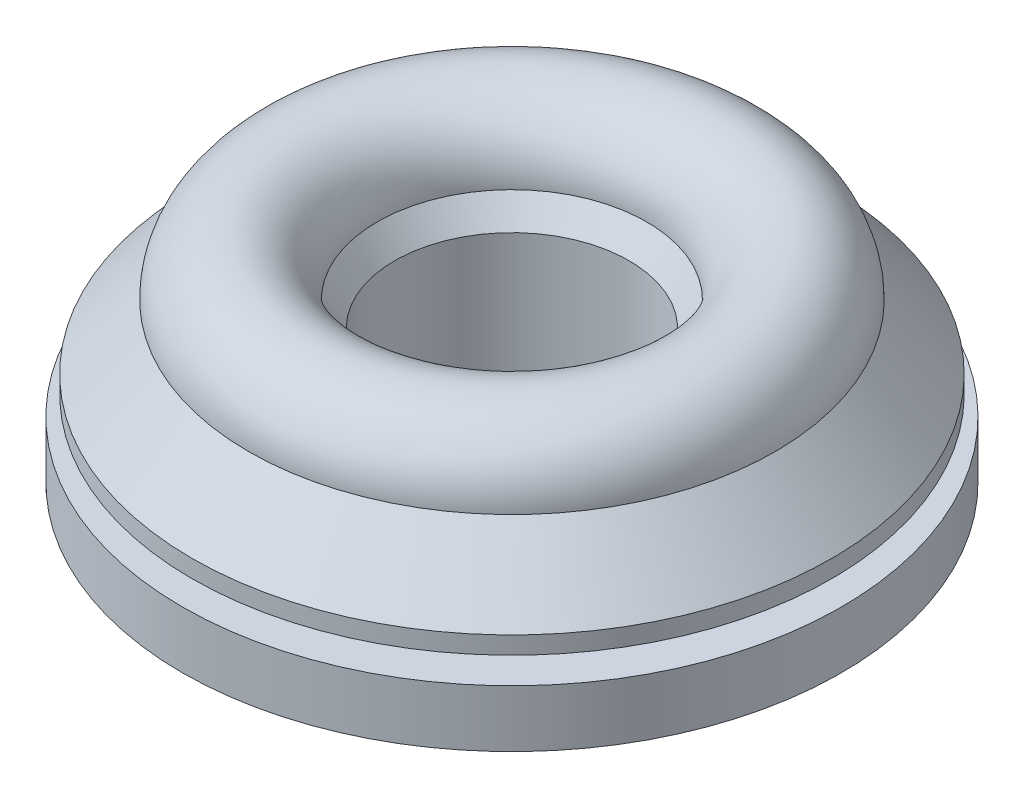
ISO-10303-21;
HEADER;
FILE_DESCRIPTION(('STEP AP214'),'2;1');
FILE_NAME('part.step','',(''),(''),'','','');
FILE_SCHEMA(('AUTOMOTIVE_DESIGN { 1 0 10303 214 1 1 1 1 }'));
ENDSEC;
DATA;
#1=APPLICATION_CONTEXT('core data for automotive mechanical design processes');
#2=APPLICATION_PROTOCOL_DEFINITION('international standard','automotive_design',2000,#1);
#3=PRODUCT_CONTEXT('',#1,'mechanical');
#4=PRODUCT('Part','Part','',(#3));
#5=PRODUCT_RELATED_PRODUCT_CATEGORY('part','',(#4));
#6=PRODUCT_DEFINITION_FORMATION('','',#4);
#7=PRODUCT_DEFINITION_CONTEXT('part definition',#1,'design');
#8=PRODUCT_DEFINITION('design','',#6,#7);
#9=PRODUCT_DEFINITION_SHAPE('','',#8);
#10=(LENGTH_UNIT() NAMED_UNIT(*) SI_UNIT(.MILLI.,.METRE.));
#11=(NAMED_UNIT(*) PLANE_ANGLE_UNIT() SI_UNIT($,.RADIAN.));
#12=(NAMED_UNIT(*) SI_UNIT($,.STERADIAN.) SOLID_ANGLE_UNIT());
#13=UNCERTAINTY_MEASURE_WITH_UNIT(LENGTH_MEASURE(1.E-05),#10,'distance_accuracy_value','');
#14=(GEOMETRIC_REPRESENTATION_CONTEXT(3) GLOBAL_UNCERTAINTY_ASSIGNED_CONTEXT((#13)) GLOBAL_UNIT_ASSIGNED_CONTEXT((#10,
#11,#12)) REPRESENTATION_CONTEXT('',''));
#15=CARTESIAN_POINT('',(0.,0.,0.));
#16=DIRECTION('',(0.,0.,1.));
#17=DIRECTION('',(1.,0.,0.));
#18=AXIS2_PLACEMENT_3D('',#15,#16,#17);
#19=CARTESIAN_POINT('',(0.,10.1346,0.));
#20=DIRECTION('',(0.,1.,0.));
#21=DIRECTION('',(0.,0.,1.));
#22=AXIS2_PLACEMENT_3D('',#19,#20,#21);
#23=CYLINDRICAL_SURFACE('',#22,21.43125);
#24=CARTESIAN_POINT('',(0.,-0.635,0.));
#25=DIRECTION('',(0.,1.,0.));
#26=DIRECTION('',(0.,0.,1.));
#27=AXIS2_PLACEMENT_3D('',#24,#25,#26);
#28=CIRCLE('',#27,21.43125);
#29=CARTESIAN_POINT('',(0.,-0.635,21.43125));
#30=VERTEX_POINT('',#29);
#31=EDGE_CURVE('E10',#30,#30,#28,.T.);
#32=ORIENTED_EDGE('',*,*,#31,.F.);
#33=EDGE_LOOP('',(#32));
#34=FACE_BOUND('',#33,.T.);
#35=CARTESIAN_POINT('',(0.,-4.3434,0.));
#36=DIRECTION('',(0.,1.,0.));
#37=DIRECTION('',(0.,0.,1.));
#38=AXIS2_PLACEMENT_3D('',#35,#36,#37);
#39=CIRCLE('',#38,21.43125);
#40=CARTESIAN_POINT('',(0.,-4.3434,21.43125));
#41=VERTEX_POINT('',#40);
#42=EDGE_CURVE('E86',#41,#41,#39,.T.);
#43=ORIENTED_EDGE('',*,*,#42,.T.);
#44=EDGE_LOOP('',(#43));
#45=FACE_BOUND('',#44,.T.);
#46=ADVANCED_FACE('F40',(#34,#45),#23,.T.);
#47=CARTESIAN_POINT('',(21.43125,-0.635,0.));
#48=DIRECTION('',(0.,-1.,0.));
#49=DIRECTION('',(0.,0.,-1.));
#50=AXIS2_PLACEMENT_3D('',#47,#48,#49);
#51=PLANE('',#50);
#52=CARTESIAN_POINT('',(0.,-0.635,0.));
#53=DIRECTION('',(0.,1.,0.));
#54=DIRECTION('',(0.,0.,1.));
#55=AXIS2_PLACEMENT_3D('',#52,#53,#54);
#56=CIRCLE('',#55,17.4625);
#57=CARTESIAN_POINT('',(0.,-0.635,17.4625));
#58=VERTEX_POINT('',#57);
#59=EDGE_CURVE('E47',#58,#58,#56,.T.);
#60=ORIENTED_EDGE('',*,*,#59,.F.);
#61=EDGE_LOOP('',(#60));
#62=FACE_BOUND('',#61,.T.);
#63=ORIENTED_EDGE('',*,*,#31,.T.);
#64=EDGE_LOOP('',(#63));
#65=FACE_BOUND('',#64,.T.);
#66=ADVANCED_FACE('F136',(#62,#65),#51,.F.);
#67=CARTESIAN_POINT('',(0.,10.1346,0.));
#68=DIRECTION('',(0.,1.,0.));
#69=DIRECTION('',(0.,0.,1.));
#70=AXIS2_PLACEMENT_3D('',#67,#68,#69);
#71=CYLINDRICAL_SURFACE('',#70,17.4625);
#72=CARTESIAN_POINT('',(0.,0.635,0.));
#73=DIRECTION('',(0.,1.,0.));
#74=DIRECTION('',(0.,0.,1.));
#75=AXIS2_PLACEMENT_3D('',#72,#73,#74);
#76=CIRCLE('',#75,17.4625);
#77=CARTESIAN_POINT('',(0.,0.635,17.4625));
#78=VERTEX_POINT('',#77);
#79=EDGE_CURVE('E55',#78,#78,#76,.T.);
#80=ORIENTED_EDGE('',*,*,#79,.F.);
#81=EDGE_LOOP('',(#80));
#82=FACE_BOUND('',#81,.T.);
#83=ORIENTED_EDGE('',*,*,#59,.T.);
#84=EDGE_LOOP('',(#83));
#85=FACE_BOUND('',#84,.T.);
#86=ADVANCED_FACE('F131',(#82,#85),#71,.T.);
#87=CARTESIAN_POINT('',(17.4625,0.635,0.));
#88=DIRECTION('',(0.,1.,0.));
#89=DIRECTION('',(0.,0.,1.));
#90=AXIS2_PLACEMENT_3D('',#87,#88,#89);
#91=PLANE('',#90);
#92=CARTESIAN_POINT('',(0.,0.635,0.));
#93=DIRECTION('',(0.,1.,0.));
#94=DIRECTION('',(0.,0.,1.));
#95=AXIS2_PLACEMENT_3D('',#92,#93,#94);
#96=CIRCLE('',#95,20.79625);
#97=CARTESIAN_POINT('',(0.,0.635,20.79625));
#98=VERTEX_POINT('',#97);
#99=EDGE_CURVE('E62',#98,#98,#96,.T.);
#100=ORIENTED_EDGE('',*,*,#99,.F.);
#101=EDGE_LOOP('',(#100));
#102=FACE_BOUND('',#101,.T.);
#103=ORIENTED_EDGE('',*,*,#79,.T.);
#104=EDGE_LOOP('',(#103));
#105=FACE_BOUND('',#104,.T.);
#106=ADVANCED_FACE('F125',(#102,#105),#91,.F.);
#107=CARTESIAN_POINT('',(0.,10.1346,0.));
#108=DIRECTION('',(0.,1.,0.));
#109=DIRECTION('',(0.,0.,1.));
#110=AXIS2_PLACEMENT_3D('',#107,#108,#109);
#111=CYLINDRICAL_SURFACE('',#110,20.79625);
#112=CARTESIAN_POINT('',(0.,1.778,0.));
#113=DIRECTION('',(0.,1.,0.));
#114=DIRECTION('',(0.,0.,1.));
#115=AXIS2_PLACEMENT_3D('',#112,#113,#114);
#116=CIRCLE('',#115,20.79625);
#117=CARTESIAN_POINT('',(0.,1.778,20.79625));
#118=VERTEX_POINT('',#117);
#119=EDGE_CURVE('E67',#118,#118,#116,.T.);
#120=ORIENTED_EDGE('',*,*,#119,.F.);
#121=EDGE_LOOP('',(#120));
#122=FACE_BOUND('',#121,.T.);
#123=ORIENTED_EDGE('',*,*,#99,.T.);
#124=EDGE_LOOP('',(#123));
#125=FACE_BOUND('',#124,.T.);
#126=ADVANCED_FACE('F119',(#122,#125),#111,.T.);
#127=CARTESIAN_POINT('',(0.,1.778,0.));
#128=DIRECTION('',(0.,-1.,0.));
#129=DIRECTION('',(0.,0.,-1.));
#130=AXIS2_PLACEMENT_3D('',#127,#128,#129);
#131=CONICAL_SURFACE('',#130,20.79625,0.721620590209713);
#132=CARTESIAN_POINT('',(0.,5.9563,0.));
#133=DIRECTION('',(0.,1.,0.));
#134=DIRECTION('',(0.,0.,1.));
#135=AXIS2_PLACEMENT_3D('',#132,#133,#134);
#136=CIRCLE('',#135,17.1196);
#137=CARTESIAN_POINT('',(0.,5.9563,17.1196));
#138=VERTEX_POINT('',#137);
#139=EDGE_CURVE('E70',#138,#138,#136,.T.);
#140=ORIENTED_EDGE('',*,*,#139,.F.);
#141=EDGE_LOOP('',(#140));
#142=FACE_BOUND('',#141,.T.);
#143=ORIENTED_EDGE('',*,*,#119,.T.);
#144=EDGE_LOOP('',(#143));
#145=FACE_BOUND('',#144,.T.);
#146=ADVANCED_FACE('F113',(#142,#145),#131,.T.);
#147=CARTESIAN_POINT('',(0.,5.9563,0.));
#148=DIRECTION('',(0.,1.,0.));
#149=DIRECTION('',(0.,0.,1.));
#150=AXIS2_PLACEMENT_3D('',#147,#148,#149);
#151=TOROIDAL_SURFACE('',#150,12.9413,4.1783);
#152=CARTESIAN_POINT('',(0.,5.9563,0.));
#153=DIRECTION('',(0.,1.,0.));
#154=DIRECTION('',(0.,0.,1.));
#155=AXIS2_PLACEMENT_3D('',#152,#153,#154);
#156=CIRCLE('',#155,8.763);
#157=CARTESIAN_POINT('',(0.,5.9563,8.763));
#158=VERTEX_POINT('',#157);
#159=EDGE_CURVE('E74',#158,#158,#156,.T.);
#160=ORIENTED_EDGE('',*,*,#159,.F.);
#161=EDGE_LOOP('',(#160));
#162=FACE_BOUND('',#161,.T.);
#163=ORIENTED_EDGE('',*,*,#139,.T.);
#164=EDGE_LOOP('',(#163));
#165=FACE_BOUND('',#164,.T.);
#166=ADVANCED_FACE('F107',(#162,#165),#151,.T.);
#167=CARTESIAN_POINT('',(0.,5.9563,0.));
#168=DIRECTION('',(0.,1.,0.));
#169=DIRECTION('',(0.,0.,1.));
#170=AXIS2_PLACEMENT_3D('',#167,#168,#169);
#171=CONICAL_SURFACE('',#170,8.763,0.61651537339085);
#172=CARTESIAN_POINT('',(0.,4.3434,0.));
#173=DIRECTION('',(0.,1.,0.));
#174=DIRECTION('',(0.,0.,1.));
#175=AXIS2_PLACEMENT_3D('',#172,#173,#174);
#176=CIRCLE('',#175,7.62);
#177=CARTESIAN_POINT('',(0.,4.3434,7.62));
#178=VERTEX_POINT('',#177);
#179=EDGE_CURVE('E78',#178,#178,#176,.T.);
#180=ORIENTED_EDGE('',*,*,#179,.F.);
#181=EDGE_LOOP('',(#180));
#182=FACE_BOUND('',#181,.T.);
#183=ORIENTED_EDGE('',*,*,#159,.T.);
#184=EDGE_LOOP('',(#183));
#185=FACE_BOUND('',#184,.T.);
#186=ADVANCED_FACE('F101',(#182,#185),#171,.F.);
#187=CARTESIAN_POINT('',(0.,10.1346,0.));
#188=DIRECTION('',(0.,1.,0.));
#189=DIRECTION('',(0.,0.,1.));
#190=AXIS2_PLACEMENT_3D('',#187,#188,#189);
#191=CYLINDRICAL_SURFACE('',#190,7.62);
#192=CARTESIAN_POINT('',(0.,-4.3434,0.));
#193=DIRECTION('',(0.,1.,0.));
#194=DIRECTION('',(0.,0.,1.));
#195=AXIS2_PLACEMENT_3D('',#192,#193,#194);
#196=CIRCLE('',#195,7.62);
#197=CARTESIAN_POINT('',(0.,-4.3434,7.62));
#198=VERTEX_POINT('',#197);
#199=EDGE_CURVE('E82',#198,#198,#196,.T.);
#200=ORIENTED_EDGE('',*,*,#199,.F.);
#201=EDGE_LOOP('',(#200));
#202=FACE_BOUND('',#201,.T.);
#203=ORIENTED_EDGE('',*,*,#179,.T.);
#204=EDGE_LOOP('',(#203));
#205=FACE_BOUND('',#204,.T.);
#206=ADVANCED_FACE('F95',(#202,#205),#191,.F.);
#207=CARTESIAN_POINT('',(7.62,-4.3434,0.));
#208=DIRECTION('',(0.,1.,0.));
#209=DIRECTION('',(0.,0.,1.));
#210=AXIS2_PLACEMENT_3D('',#207,#208,#209);
#211=PLANE('',#210);
#212=ORIENTED_EDGE('',*,*,#42,.F.);
#213=EDGE_LOOP('',(#212));
#214=FACE_BOUND('',#213,.T.);
#215=ORIENTED_EDGE('',*,*,#199,.T.);
#216=EDGE_LOOP('',(#215));
#217=FACE_BOUND('',#216,.T.);
#218=ADVANCED_FACE('F92',(#214,#217),#211,.F.);
#219=CLOSED_SHELL('',(#46,#66,#86,#106,#126,#146,#166,#186,#206,#218));
#220=MANIFOLD_SOLID_BREP('B2',#219);
#221=ADVANCED_BREP_SHAPE_REPRESENTATION('',(#18,#220),#14);
#222=SHAPE_DEFINITION_REPRESENTATION(#9,#221);
ENDSEC;
END-ISO-10303-21;
